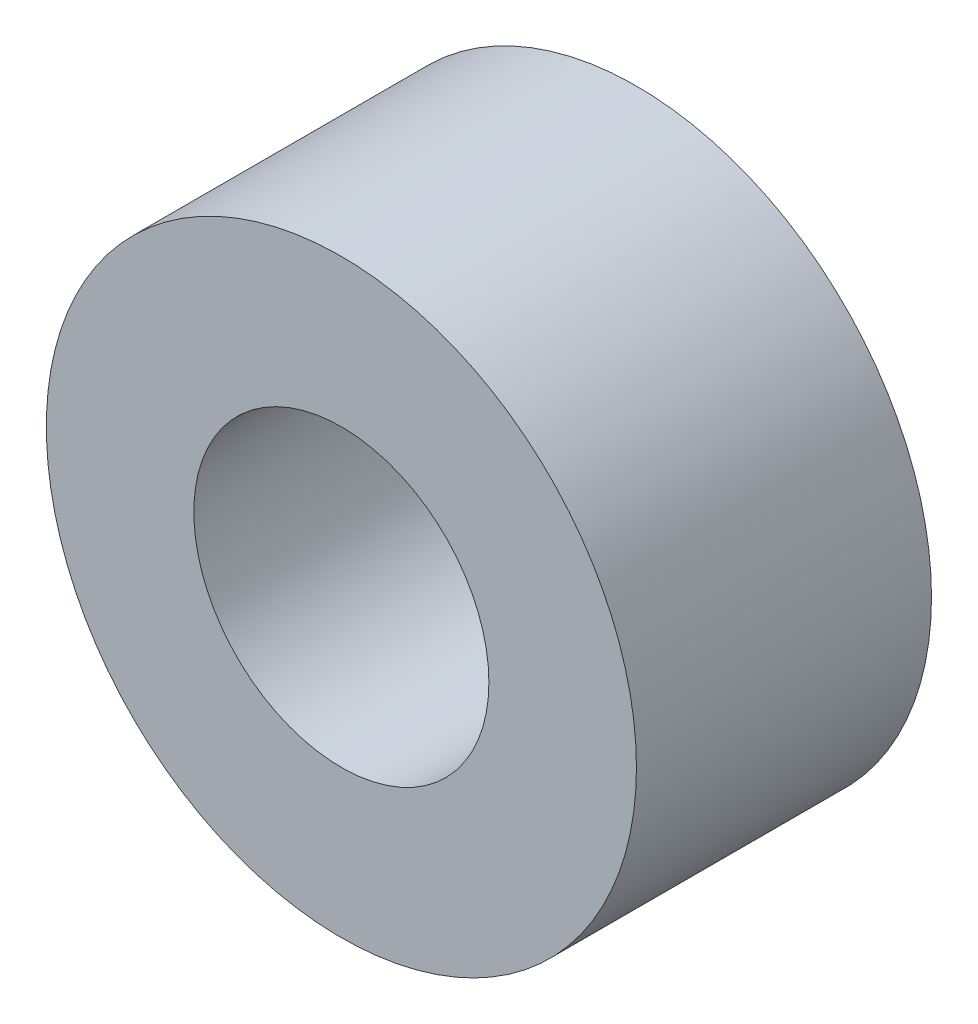
ISO-10303-21;
HEADER;
FILE_DESCRIPTION(('STEP AP214'),'2;1');
FILE_NAME('part.step','',(''),(''),'','','');
FILE_SCHEMA(('AUTOMOTIVE_DESIGN { 1 0 10303 214 1 1 1 1 }'));
ENDSEC;
DATA;
#1=APPLICATION_CONTEXT('core data for automotive mechanical design processes');
#2=APPLICATION_PROTOCOL_DEFINITION('international standard','automotive_design',2000,#1);
#3=PRODUCT_CONTEXT('',#1,'mechanical');
#4=PRODUCT('Part','Part','',(#3));
#5=PRODUCT_RELATED_PRODUCT_CATEGORY('part','',(#4));
#6=PRODUCT_DEFINITION_FORMATION('','',#4);
#7=PRODUCT_DEFINITION_CONTEXT('part definition',#1,'design');
#8=PRODUCT_DEFINITION('design','',#6,#7);
#9=PRODUCT_DEFINITION_SHAPE('','',#8);
#10=(LENGTH_UNIT() NAMED_UNIT(*) SI_UNIT(.MILLI.,.METRE.));
#11=(NAMED_UNIT(*) PLANE_ANGLE_UNIT() SI_UNIT($,.RADIAN.));
#12=(NAMED_UNIT(*) SI_UNIT($,.STERADIAN.) SOLID_ANGLE_UNIT());
#13=UNCERTAINTY_MEASURE_WITH_UNIT(LENGTH_MEASURE(1.E-05),#10,'distance_accuracy_value','');
#14=(GEOMETRIC_REPRESENTATION_CONTEXT(3) GLOBAL_UNCERTAINTY_ASSIGNED_CONTEXT((#13)) GLOBAL_UNIT_ASSIGNED_CONTEXT((#10,
#11,#12)) REPRESENTATION_CONTEXT('',''));
#15=CARTESIAN_POINT('',(0.,0.,0.));
#16=DIRECTION('',(0.,0.,1.));
#17=DIRECTION('',(1.,0.,0.));
#18=AXIS2_PLACEMENT_3D('',#15,#16,#17);
#19=CARTESIAN_POINT('',(-43.1601105241046,-91.7569329261232,1.5875));
#20=DIRECTION('',(0.,0.,1.));
#21=DIRECTION('',(1.,0.,0.));
#22=AXIS2_PLACEMENT_3D('',#19,#20,#21);
#23=PLANE('',#22);
#24=CARTESIAN_POINT('',(-43.1601105241046,-91.7569329261232,1.5875));
#25=DIRECTION('',(0.,0.,1.));
#26=DIRECTION('',(1.,0.,0.));
#27=AXIS2_PLACEMENT_3D('',#24,#25,#26);
#28=CIRCLE('',#27,3.175);
#29=CARTESIAN_POINT('',(-39.9851105241046,-91.7569329261232,1.5875));
#30=VERTEX_POINT('',#29);
#31=EDGE_CURVE('E10',#30,#30,#28,.T.);
#32=ORIENTED_EDGE('',*,*,#31,.T.);
#33=EDGE_LOOP('',(#32));
#34=FACE_BOUND('',#33,.T.);
#35=CARTESIAN_POINT('',(-43.1601105241046,-91.7569329261232,1.5875));
#36=DIRECTION('',(0.,0.,1.));
#37=DIRECTION('',(1.,0.,0.));
#38=AXIS2_PLACEMENT_3D('',#35,#36,#37);
#39=CIRCLE('',#38,1.5875);
#40=CARTESIAN_POINT('',(-41.5726105241046,-91.7569329261232,1.5875));
#41=VERTEX_POINT('',#40);
#42=EDGE_CURVE('E43',#41,#41,#39,.T.);
#43=ORIENTED_EDGE('',*,*,#42,.F.);
#44=EDGE_LOOP('',(#43));
#45=FACE_BOUND('',#44,.T.);
#46=ADVANCED_FACE('F32',(#34,#45),#23,.T.);
#47=CARTESIAN_POINT('',(-43.1601105241046,-91.7569329261232,-1.5875));
#48=DIRECTION('',(0.,0.,1.));
#49=DIRECTION('',(1.,0.,0.));
#50=AXIS2_PLACEMENT_3D('',#47,#48,#49);
#51=PLANE('',#50);
#52=CARTESIAN_POINT('',(-43.1601105241046,-91.7569329261232,-1.5875));
#53=DIRECTION('',(0.,0.,1.));
#54=DIRECTION('',(1.,0.,0.));
#55=AXIS2_PLACEMENT_3D('',#52,#53,#54);
#56=CIRCLE('',#55,3.175);
#57=CARTESIAN_POINT('',(-39.9851105241046,-91.7569329261232,-1.5875));
#58=VERTEX_POINT('',#57);
#59=EDGE_CURVE('E36',#58,#58,#56,.T.);
#60=ORIENTED_EDGE('',*,*,#59,.F.);
#61=EDGE_LOOP('',(#60));
#62=FACE_BOUND('',#61,.T.);
#63=CARTESIAN_POINT('',(-43.1601105241046,-91.7569329261232,-1.5875));
#64=DIRECTION('',(0.,0.,1.));
#65=DIRECTION('',(1.,0.,0.));
#66=AXIS2_PLACEMENT_3D('',#63,#64,#65);
#67=CIRCLE('',#66,1.5875);
#68=CARTESIAN_POINT('',(-41.5726105241046,-91.7569329261232,-1.5875));
#69=VERTEX_POINT('',#68);
#70=EDGE_CURVE('E45',#69,#69,#67,.T.);
#71=ORIENTED_EDGE('',*,*,#70,.T.);
#72=EDGE_LOOP('',(#71));
#73=FACE_BOUND('',#72,.T.);
#74=ADVANCED_FACE('F55',(#62,#73),#51,.F.);
#75=CARTESIAN_POINT('',(-43.1601105241046,-91.7569329261232,1.5875));
#76=DIRECTION('',(0.,0.,-1.));
#77=DIRECTION('',(-1.,0.,0.));
#78=AXIS2_PLACEMENT_3D('',#75,#76,#77);
#79=CYLINDRICAL_SURFACE('',#78,3.175);
#80=ORIENTED_EDGE('',*,*,#31,.F.);
#81=EDGE_LOOP('',(#80));
#82=FACE_BOUND('',#81,.T.);
#83=ORIENTED_EDGE('',*,*,#59,.T.);
#84=EDGE_LOOP('',(#83));
#85=FACE_BOUND('',#84,.T.);
#86=ADVANCED_FACE('F34',(#82,#85),#79,.T.);
#87=CARTESIAN_POINT('',(-43.1601105241046,-91.7569329261232,1.5875));
#88=DIRECTION('',(0.,0.,-1.));
#89=DIRECTION('',(-1.,0.,0.));
#90=AXIS2_PLACEMENT_3D('',#87,#88,#89);
#91=CYLINDRICAL_SURFACE('',#90,1.5875);
#92=ORIENTED_EDGE('',*,*,#42,.T.);
#93=EDGE_LOOP('',(#92));
#94=FACE_BOUND('',#93,.T.);
#95=ORIENTED_EDGE('',*,*,#70,.F.);
#96=EDGE_LOOP('',(#95));
#97=FACE_BOUND('',#96,.T.);
#98=ADVANCED_FACE('F51',(#94,#97),#91,.F.);
#99=CLOSED_SHELL('',(#46,#74,#86,#98));
#100=MANIFOLD_SOLID_BREP('B2',#99);
#101=ADVANCED_BREP_SHAPE_REPRESENTATION('',(#18,#100),#14);
#102=SHAPE_DEFINITION_REPRESENTATION(#9,#101);
ENDSEC;
END-ISO-10303-21;
